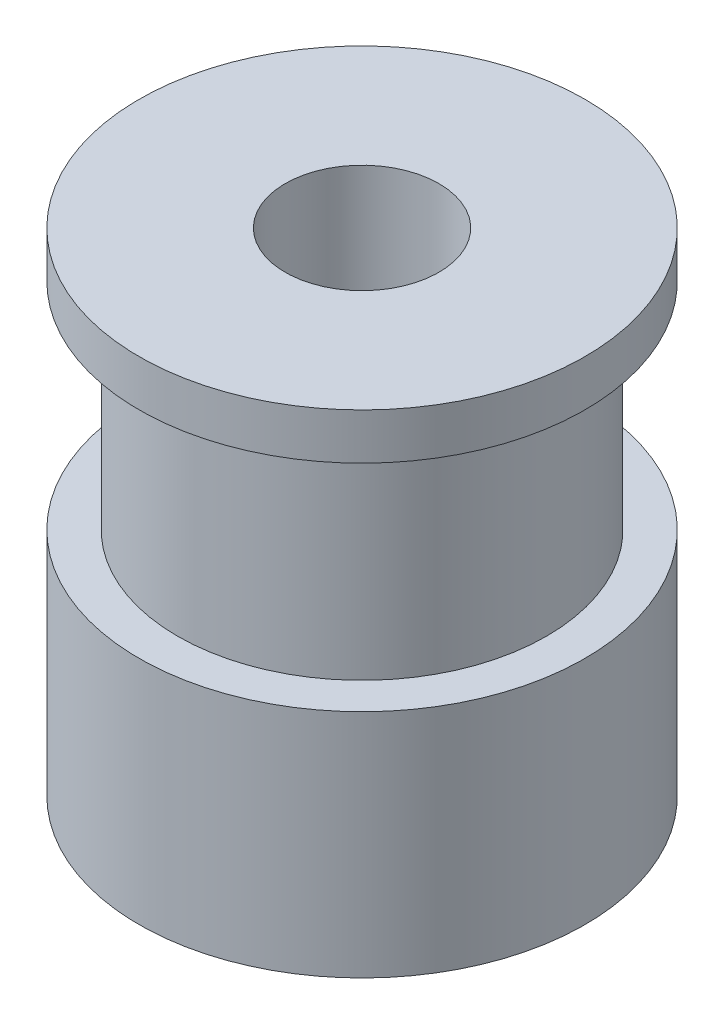
ISO-10303-21;
HEADER;
FILE_DESCRIPTION(('STEP AP214'),'2;1');
FILE_NAME('part.step','',(''),(''),'','','');
FILE_SCHEMA(('AUTOMOTIVE_DESIGN { 1 0 10303 214 1 1 1 1 }'));
ENDSEC;
DATA;
#1=APPLICATION_CONTEXT('core data for automotive mechanical design processes');
#2=APPLICATION_PROTOCOL_DEFINITION('international standard','automotive_design',2000,#1);
#3=PRODUCT_CONTEXT('',#1,'mechanical');
#4=PRODUCT('Part','Part','',(#3));
#5=PRODUCT_RELATED_PRODUCT_CATEGORY('part','',(#4));
#6=PRODUCT_DEFINITION_FORMATION('','',#4);
#7=PRODUCT_DEFINITION_CONTEXT('part definition',#1,'design');
#8=PRODUCT_DEFINITION('design','',#6,#7);
#9=PRODUCT_DEFINITION_SHAPE('','',#8);
#10=(LENGTH_UNIT() NAMED_UNIT(*) SI_UNIT(.MILLI.,.METRE.));
#11=(NAMED_UNIT(*) PLANE_ANGLE_UNIT() SI_UNIT($,.RADIAN.));
#12=(NAMED_UNIT(*) SI_UNIT($,.STERADIAN.) SOLID_ANGLE_UNIT());
#13=UNCERTAINTY_MEASURE_WITH_UNIT(LENGTH_MEASURE(1.E-05),#10,'distance_accuracy_value','');
#14=(GEOMETRIC_REPRESENTATION_CONTEXT(3) GLOBAL_UNCERTAINTY_ASSIGNED_CONTEXT((#13)) GLOBAL_UNIT_ASSIGNED_CONTEXT((#10,
#11,#12)) REPRESENTATION_CONTEXT('',''));
#15=CARTESIAN_POINT('',(0.,0.,0.));
#16=DIRECTION('',(0.,0.,1.));
#17=DIRECTION('',(1.,0.,0.));
#18=AXIS2_PLACEMENT_3D('',#15,#16,#17);
#19=CARTESIAN_POINT('',(7.25000000000001,0.,0.));
#20=DIRECTION('',(0.,-1.,0.));
#21=DIRECTION('',(0.,0.,-1.));
#22=AXIS2_PLACEMENT_3D('',#19,#20,#21);
#23=PLANE('',#22);
#24=CARTESIAN_POINT('',(0.,0.,0.));
#25=DIRECTION('',(0.,-1.,0.));
#26=DIRECTION('',(0.,0.,-1.));
#27=AXIS2_PLACEMENT_3D('',#24,#25,#26);
#28=CIRCLE('',#27,7.25000000000001);
#29=CARTESIAN_POINT('',(0.,0.,-7.25000000000001));
#30=VERTEX_POINT('',#29);
#31=EDGE_CURVE('E61',#30,#30,#28,.T.);
#32=ORIENTED_EDGE('',*,*,#31,.T.);
#33=EDGE_LOOP('',(#32));
#34=FACE_BOUND('',#33,.T.);
#35=CARTESIAN_POINT('',(0.,0.,0.));
#36=DIRECTION('',(0.,-1.,0.));
#37=DIRECTION('',(0.,0.,-1.));
#38=AXIS2_PLACEMENT_3D('',#35,#36,#37);
#39=CIRCLE('',#38,2.5);
#40=CARTESIAN_POINT('',(0.,0.,-2.5));
#41=VERTEX_POINT('',#40);
#42=EDGE_CURVE('E10',#41,#41,#39,.T.);
#43=ORIENTED_EDGE('',*,*,#42,.F.);
#44=EDGE_LOOP('',(#43));
#45=FACE_BOUND('',#44,.T.);
#46=ADVANCED_FACE('F33',(#34,#45),#23,.T.);
#47=CARTESIAN_POINT('',(0.,0.,0.));
#48=DIRECTION('',(0.,-1.,0.));
#49=DIRECTION('',(0.,0.,-1.));
#50=AXIS2_PLACEMENT_3D('',#47,#48,#49);
#51=CYLINDRICAL_SURFACE('',#50,2.5);
#52=ORIENTED_EDGE('',*,*,#42,.T.);
#53=EDGE_LOOP('',(#52));
#54=FACE_BOUND('',#53,.T.);
#55=CARTESIAN_POINT('',(0.,16.,0.));
#56=DIRECTION('',(0.,-1.,0.));
#57=DIRECTION('',(0.,0.,-1.));
#58=AXIS2_PLACEMENT_3D('',#55,#56,#57);
#59=CIRCLE('',#58,2.5);
#60=CARTESIAN_POINT('',(0.,16.,-2.5));
#61=VERTEX_POINT('',#60);
#62=EDGE_CURVE('E39',#61,#61,#59,.T.);
#63=ORIENTED_EDGE('',*,*,#62,.F.);
#64=EDGE_LOOP('',(#63));
#65=FACE_BOUND('',#64,.T.);
#66=ADVANCED_FACE('F79',(#54,#65),#51,.F.);
#67=CARTESIAN_POINT('',(2.5,16.,0.));
#68=DIRECTION('',(0.,1.,0.));
#69=DIRECTION('',(0.,0.,1.));
#70=AXIS2_PLACEMENT_3D('',#67,#68,#69);
#71=PLANE('',#70);
#72=ORIENTED_EDGE('',*,*,#62,.T.);
#73=EDGE_LOOP('',(#72));
#74=FACE_BOUND('',#73,.T.);
#75=CARTESIAN_POINT('',(0.,16.,0.));
#76=DIRECTION('',(0.,-1.,0.));
#77=DIRECTION('',(0.,0.,-1.));
#78=AXIS2_PLACEMENT_3D('',#75,#76,#77);
#79=CIRCLE('',#78,7.25000000000001);
#80=CARTESIAN_POINT('',(0.,16.,-7.25000000000001));
#81=VERTEX_POINT('',#80);
#82=EDGE_CURVE('E43',#81,#81,#79,.T.);
#83=ORIENTED_EDGE('',*,*,#82,.F.);
#84=EDGE_LOOP('',(#83));
#85=FACE_BOUND('',#84,.T.);
#86=ADVANCED_FACE('F83',(#74,#85),#71,.T.);
#87=CARTESIAN_POINT('',(0.,0.,0.));
#88=DIRECTION('',(0.,-1.,0.));
#89=DIRECTION('',(0.,0.,-1.));
#90=AXIS2_PLACEMENT_3D('',#87,#88,#89);
#91=CYLINDRICAL_SURFACE('',#90,7.25000000000001);
#92=ORIENTED_EDGE('',*,*,#82,.T.);
#93=EDGE_LOOP('',(#92));
#94=FACE_BOUND('',#93,.T.);
#95=CARTESIAN_POINT('',(0.,14.5,0.));
#96=DIRECTION('',(0.,-1.,0.));
#97=DIRECTION('',(0.,0.,-1.));
#98=AXIS2_PLACEMENT_3D('',#95,#96,#97);
#99=CIRCLE('',#98,7.25000000000001);
#100=CARTESIAN_POINT('',(0.,14.5,-7.25000000000001));
#101=VERTEX_POINT('',#100);
#102=EDGE_CURVE('E47',#101,#101,#99,.T.);
#103=ORIENTED_EDGE('',*,*,#102,.F.);
#104=EDGE_LOOP('',(#103));
#105=FACE_BOUND('',#104,.T.);
#106=ADVANCED_FACE('F87',(#94,#105),#91,.T.);
#107=CARTESIAN_POINT('',(7.25000000000001,14.5,0.));
#108=DIRECTION('',(0.,-1.,0.));
#109=DIRECTION('',(0.,0.,-1.));
#110=AXIS2_PLACEMENT_3D('',#107,#108,#109);
#111=PLANE('',#110);
#112=ORIENTED_EDGE('',*,*,#102,.T.);
#113=EDGE_LOOP('',(#112));
#114=FACE_BOUND('',#113,.T.);
#115=CARTESIAN_POINT('',(0.,14.5,0.));
#116=DIRECTION('',(0.,-1.,0.));
#117=DIRECTION('',(0.,0.,-1.));
#118=AXIS2_PLACEMENT_3D('',#115,#116,#117);
#119=CIRCLE('',#118,6.);
#120=CARTESIAN_POINT('',(0.,14.5,-6.));
#121=VERTEX_POINT('',#120);
#122=EDGE_CURVE('E52',#121,#121,#119,.T.);
#123=ORIENTED_EDGE('',*,*,#122,.F.);
#124=EDGE_LOOP('',(#123));
#125=FACE_BOUND('',#124,.T.);
#126=ADVANCED_FACE('F93',(#114,#125),#111,.T.);
#127=CARTESIAN_POINT('',(0.,0.,0.));
#128=DIRECTION('',(0.,-1.,0.));
#129=DIRECTION('',(0.,0.,-1.));
#130=AXIS2_PLACEMENT_3D('',#127,#128,#129);
#131=CYLINDRICAL_SURFACE('',#130,6.);
#132=ORIENTED_EDGE('',*,*,#122,.T.);
#133=EDGE_LOOP('',(#132));
#134=FACE_BOUND('',#133,.T.);
#135=CARTESIAN_POINT('',(0.,7.5,0.));
#136=DIRECTION('',(0.,-1.,0.));
#137=DIRECTION('',(0.,0.,-1.));
#138=AXIS2_PLACEMENT_3D('',#135,#136,#137);
#139=CIRCLE('',#138,6.);
#140=CARTESIAN_POINT('',(0.,7.5,-6.));
#141=VERTEX_POINT('',#140);
#142=EDGE_CURVE('E55',#141,#141,#139,.T.);
#143=ORIENTED_EDGE('',*,*,#142,.F.);
#144=EDGE_LOOP('',(#143));
#145=FACE_BOUND('',#144,.T.);
#146=ADVANCED_FACE('F75',(#134,#145),#131,.T.);
#147=CARTESIAN_POINT('',(6.,7.5,0.));
#148=DIRECTION('',(0.,1.,0.));
#149=DIRECTION('',(0.,0.,1.));
#150=AXIS2_PLACEMENT_3D('',#147,#148,#149);
#151=PLANE('',#150);
#152=ORIENTED_EDGE('',*,*,#142,.T.);
#153=EDGE_LOOP('',(#152));
#154=FACE_BOUND('',#153,.T.);
#155=CARTESIAN_POINT('',(0.,7.5,0.));
#156=DIRECTION('',(0.,-1.,0.));
#157=DIRECTION('',(0.,0.,-1.));
#158=AXIS2_PLACEMENT_3D('',#155,#156,#157);
#159=CIRCLE('',#158,7.25000000000001);
#160=CARTESIAN_POINT('',(0.,7.5,-7.25000000000001));
#161=VERTEX_POINT('',#160);
#162=EDGE_CURVE('E58',#161,#161,#159,.T.);
#163=ORIENTED_EDGE('',*,*,#162,.F.);
#164=EDGE_LOOP('',(#163));
#165=FACE_BOUND('',#164,.T.);
#166=ADVANCED_FACE('F69',(#154,#165),#151,.T.);
#167=CARTESIAN_POINT('',(0.,0.,0.));
#168=DIRECTION('',(0.,-1.,0.));
#169=DIRECTION('',(0.,0.,-1.));
#170=AXIS2_PLACEMENT_3D('',#167,#168,#169);
#171=CYLINDRICAL_SURFACE('',#170,7.25000000000001);
#172=ORIENTED_EDGE('',*,*,#162,.T.);
#173=EDGE_LOOP('',(#172));
#174=FACE_BOUND('',#173,.T.);
#175=ORIENTED_EDGE('',*,*,#31,.F.);
#176=EDGE_LOOP('',(#175));
#177=FACE_BOUND('',#176,.T.);
#178=ADVANCED_FACE('F67',(#174,#177),#171,.T.);
#179=CLOSED_SHELL('',(#46,#66,#86,#106,#126,#146,#166,#178));
#180=MANIFOLD_SOLID_BREP('B2',#179);
#181=ADVANCED_BREP_SHAPE_REPRESENTATION('',(#18,#180),#14);
#182=SHAPE_DEFINITION_REPRESENTATION(#9,#181);
ENDSEC;
END-ISO-10303-21;
